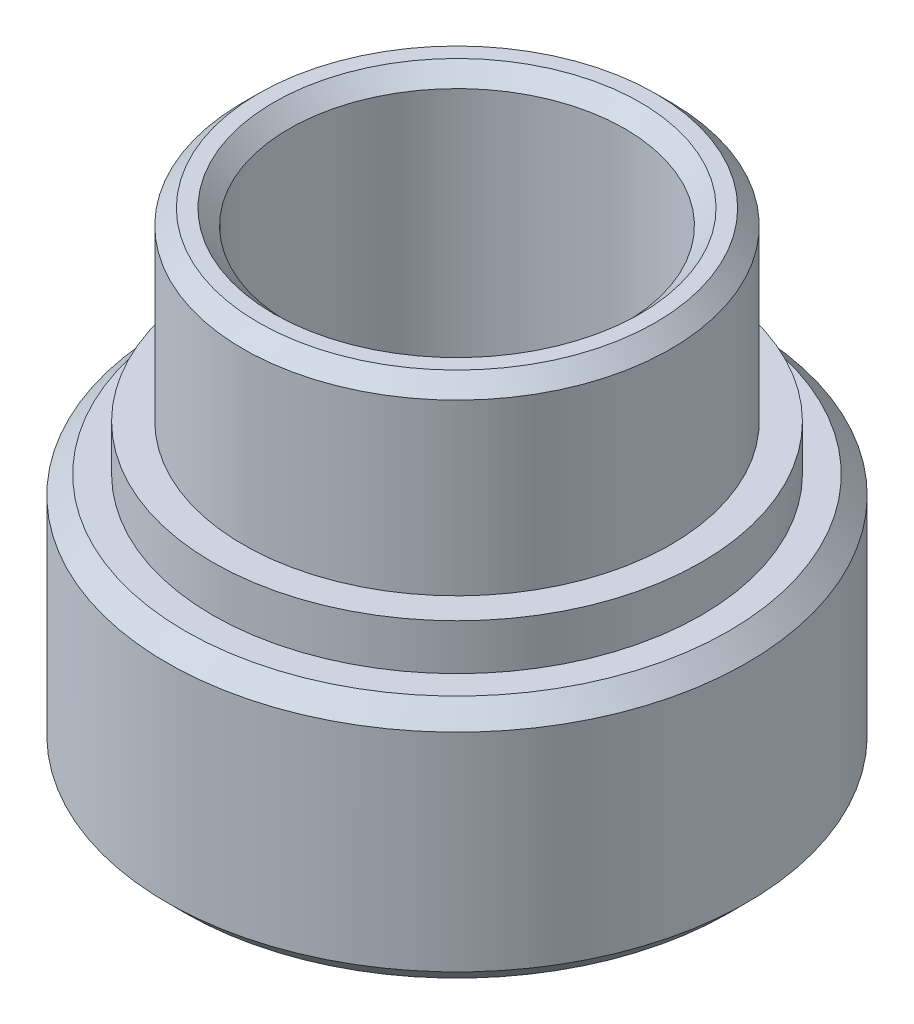
ISO-10303-21;
HEADER;
FILE_DESCRIPTION(('STEP AP214'),'2;1');
FILE_NAME('part.step','',(''),(''),'','','');
FILE_SCHEMA(('AUTOMOTIVE_DESIGN { 1 0 10303 214 1 1 1 1 }'));
ENDSEC;
DATA;
#1=APPLICATION_CONTEXT('core data for automotive mechanical design processes');
#2=APPLICATION_PROTOCOL_DEFINITION('international standard','automotive_design',2000,#1);
#3=PRODUCT_CONTEXT('',#1,'mechanical');
#4=PRODUCT('Part','Part','',(#3));
#5=PRODUCT_RELATED_PRODUCT_CATEGORY('part','',(#4));
#6=PRODUCT_DEFINITION_FORMATION('','',#4);
#7=PRODUCT_DEFINITION_CONTEXT('part definition',#1,'design');
#8=PRODUCT_DEFINITION('design','',#6,#7);
#9=PRODUCT_DEFINITION_SHAPE('','',#8);
#10=(LENGTH_UNIT() NAMED_UNIT(*) SI_UNIT(.MILLI.,.METRE.));
#11=(NAMED_UNIT(*) PLANE_ANGLE_UNIT() SI_UNIT($,.RADIAN.));
#12=(NAMED_UNIT(*) SI_UNIT($,.STERADIAN.) SOLID_ANGLE_UNIT());
#13=UNCERTAINTY_MEASURE_WITH_UNIT(LENGTH_MEASURE(1.E-05),#10,'distance_accuracy_value','');
#14=(GEOMETRIC_REPRESENTATION_CONTEXT(3) GLOBAL_UNCERTAINTY_ASSIGNED_CONTEXT((#13)) GLOBAL_UNIT_ASSIGNED_CONTEXT((#10,
#11,#12)) REPRESENTATION_CONTEXT('',''));
#15=CARTESIAN_POINT('',(0.,0.,0.));
#16=DIRECTION('',(0.,0.,1.));
#17=DIRECTION('',(1.,0.,0.));
#18=AXIS2_PLACEMENT_3D('',#15,#16,#17);
#19=CARTESIAN_POINT('',(0.,1.30917054545158,0.));
#20=DIRECTION('',(0.,-1.,0.));
#21=DIRECTION('',(0.,0.,-1.));
#22=AXIS2_PLACEMENT_3D('',#19,#20,#21);
#23=PLANE('',#22);
#24=CARTESIAN_POINT('',(0.,1.30917054545158,0.));
#25=DIRECTION('',(0.,-1.,0.));
#26=DIRECTION('',(0.,0.,-1.));
#27=AXIS2_PLACEMENT_3D('',#24,#25,#26);
#28=CIRCLE('',#27,2.75);
#29=CARTESIAN_POINT('',(0.,1.30917054545158,-2.75));
#30=VERTEX_POINT('',#29);
#31=EDGE_CURVE('E17',#30,#30,#28,.F.);
#32=ORIENTED_EDGE('',*,*,#31,.T.);
#33=EDGE_LOOP('',(#32));
#34=FACE_BOUND('',#33,.T.);
#35=ADVANCED_FACE('F14',(#34),#23,.F.);
#36=CARTESIAN_POINT('',(0.,1.75,0.));
#37=DIRECTION('',(0.,-1.,0.));
#38=DIRECTION('',(0.,0.,-1.));
#39=AXIS2_PLACEMENT_3D('',#36,#37,#38);
#40=CYLINDRICAL_SURFACE('',#39,2.75);
#41=CARTESIAN_POINT('',(0.,5.52500000009104,0.));
#42=DIRECTION('',(0.,1.,0.));
#43=DIRECTION('',(0.,0.,1.));
#44=AXIS2_PLACEMENT_3D('',#41,#42,#43);
#45=CIRCLE('',#44,2.75000000004866);
#46=CARTESIAN_POINT('',(0.,5.52500000009104,2.75000000004866));
#47=VERTEX_POINT('',#46);
#48=EDGE_CURVE('E50',#47,#47,#45,.T.);
#49=ORIENTED_EDGE('',*,*,#48,.T.);
#50=EDGE_LOOP('',(#49));
#51=FACE_BOUND('',#50,.T.);
#52=ORIENTED_EDGE('',*,*,#31,.F.);
#53=EDGE_LOOP('',(#52));
#54=FACE_BOUND('',#53,.T.);
#55=ADVANCED_FACE('F97',(#51,#54),#40,.F.);
#56=CARTESIAN_POINT('',(0.,5.7749999999146,0.));
#57=DIRECTION('',(0.,1.,0.));
#58=DIRECTION('',(0.,0.,1.));
#59=AXIS2_PLACEMENT_3D('',#56,#57,#58);
#60=CONICAL_SURFACE('',#59,2.99999999992906,0.785398163511135);
#61=ORIENTED_EDGE('',*,*,#48,.F.);
#62=EDGE_LOOP('',(#61));
#63=FACE_BOUND('',#62,.T.);
#64=CARTESIAN_POINT('',(0.,5.7749999999146,0.));
#65=DIRECTION('',(0.,1.,0.));
#66=DIRECTION('',(0.,0.,1.));
#67=AXIS2_PLACEMENT_3D('',#64,#65,#66);
#68=CIRCLE('',#67,2.99999999992906);
#69=CARTESIAN_POINT('',(0.,5.7749999999146,2.99999999992906));
#70=VERTEX_POINT('',#69);
#71=EDGE_CURVE('E54',#70,#70,#68,.F.);
#72=ORIENTED_EDGE('',*,*,#71,.F.);
#73=EDGE_LOOP('',(#72));
#74=FACE_BOUND('',#73,.T.);
#75=ADVANCED_FACE('F94',(#63,#74),#60,.F.);
#76=CARTESIAN_POINT('',(0.,-1.30917054545158,0.));
#77=DIRECTION('',(0.,1.,0.));
#78=DIRECTION('',(0.,0.,1.));
#79=AXIS2_PLACEMENT_3D('',#76,#77,#78);
#80=PLANE('',#79);
#81=CARTESIAN_POINT('',(0.,-1.30917054545158,0.));
#82=DIRECTION('',(0.,-1.,0.));
#83=DIRECTION('',(0.,0.,-1.));
#84=AXIS2_PLACEMENT_3D('',#81,#82,#83);
#85=CIRCLE('',#84,2.75);
#86=CARTESIAN_POINT('',(0.,-1.30917054545158,-2.75));
#87=VERTEX_POINT('',#86);
#88=EDGE_CURVE('E84',#87,#87,#85,.T.);
#89=ORIENTED_EDGE('',*,*,#88,.T.);
#90=EDGE_LOOP('',(#89));
#91=FACE_BOUND('',#90,.T.);
#92=ADVANCED_FACE('F96',(#91),#80,.F.);
#93=CARTESIAN_POINT('',(3.5,5.775,0.));
#94=DIRECTION('',(0.,1.,0.));
#95=DIRECTION('',(0.,0.,1.));
#96=AXIS2_PLACEMENT_3D('',#93,#94,#95);
#97=PLANE('',#96);
#98=ORIENTED_EDGE('',*,*,#71,.T.);
#99=EDGE_LOOP('',(#98));
#100=FACE_BOUND('',#99,.T.);
#101=CARTESIAN_POINT('',(0.,5.77499999997144,0.));
#102=DIRECTION('',(0.,-1.,0.));
#103=DIRECTION('',(0.,0.,-1.));
#104=AXIS2_PLACEMENT_3D('',#101,#102,#103);
#105=CIRCLE('',#104,3.24999999997999);
#106=CARTESIAN_POINT('',(0.,5.77499999997144,-3.24999999997999));
#107=VERTEX_POINT('',#106);
#108=EDGE_CURVE('E49',#107,#107,#105,.T.);
#109=ORIENTED_EDGE('',*,*,#108,.F.);
#110=EDGE_LOOP('',(#109));
#111=FACE_BOUND('',#110,.T.);
#112=ADVANCED_FACE('F91',(#100,#111),#97,.T.);
#113=CARTESIAN_POINT('',(0.,1.75,0.));
#114=DIRECTION('',(0.,-1.,0.));
#115=DIRECTION('',(0.,0.,-1.));
#116=AXIS2_PLACEMENT_3D('',#113,#114,#115);
#117=CYLINDRICAL_SURFACE('',#116,2.75);
#118=ORIENTED_EDGE('',*,*,#88,.F.);
#119=EDGE_LOOP('',(#118));
#120=FACE_BOUND('',#119,.T.);
#121=CARTESIAN_POINT('',(0.,-2.02499999988959,0.));
#122=DIRECTION('',(0.,-1.,0.));
#123=DIRECTION('',(0.,0.,-1.));
#124=AXIS2_PLACEMENT_3D('',#121,#122,#123);
#125=CIRCLE('',#124,2.75000000004866);
#126=CARTESIAN_POINT('',(0.,-2.02499999988959,-2.75000000004866));
#127=VERTEX_POINT('',#126);
#128=EDGE_CURVE('E45',#127,#127,#125,.T.);
#129=ORIENTED_EDGE('',*,*,#128,.T.);
#130=EDGE_LOOP('',(#129));
#131=FACE_BOUND('',#130,.T.);
#132=ADVANCED_FACE('F163',(#120,#131),#117,.F.);
#133=CARTESIAN_POINT('',(0.,5.5250000000342,0.));
#134=DIRECTION('',(0.,-1.,0.));
#135=DIRECTION('',(0.,0.,-1.));
#136=AXIS2_PLACEMENT_3D('',#133,#134,#135);
#137=CONICAL_SURFACE('',#136,3.49999999991724,0.785398163397448);
#138=ORIENTED_EDGE('',*,*,#108,.T.);
#139=EDGE_LOOP('',(#138));
#140=FACE_BOUND('',#139,.T.);
#141=CARTESIAN_POINT('',(0.,5.52499999997735,0.));
#142=DIRECTION('',(0.,-1.,0.));
#143=DIRECTION('',(0.,0.,-1.));
#144=AXIS2_PLACEMENT_3D('',#141,#142,#143);
#145=CIRCLE('',#144,3.5);
#146=CARTESIAN_POINT('',(0.,5.52499999997735,-3.5));
#147=VERTEX_POINT('',#146);
#148=EDGE_CURVE('E40',#147,#147,#145,.T.);
#149=ORIENTED_EDGE('',*,*,#148,.F.);
#150=EDGE_LOOP('',(#149));
#151=FACE_BOUND('',#150,.T.);
#152=ADVANCED_FACE('F159',(#140,#151),#137,.T.);
#153=CARTESIAN_POINT('',(0.,-2.27499999988368,0.));
#154=DIRECTION('',(0.,-1.,0.));
#155=DIRECTION('',(0.,0.,-1.));
#156=AXIS2_PLACEMENT_3D('',#153,#154,#155);
#157=CONICAL_SURFACE('',#156,3.00000000004275,0.785398163397448);
#158=ORIENTED_EDGE('',*,*,#128,.F.);
#159=EDGE_LOOP('',(#158));
#160=FACE_BOUND('',#159,.T.);
#161=CARTESIAN_POINT('',(0.,-2.27499999988368,0.));
#162=DIRECTION('',(0.,-1.,0.));
#163=DIRECTION('',(0.,0.,-1.));
#164=AXIS2_PLACEMENT_3D('',#161,#162,#163);
#165=CIRCLE('',#164,3.00000000004275);
#166=CARTESIAN_POINT('',(0.,-2.27499999988368,-3.00000000004275));
#167=VERTEX_POINT('',#166);
#168=EDGE_CURVE('E44',#167,#167,#165,.F.);
#169=ORIENTED_EDGE('',*,*,#168,.F.);
#170=EDGE_LOOP('',(#169));
#171=FACE_BOUND('',#170,.T.);
#172=ADVANCED_FACE('F155',(#160,#171),#157,.F.);
#173=CARTESIAN_POINT('',(0.,4.2625,0.));
#174=DIRECTION('',(0.,-1.,0.));
#175=DIRECTION('',(0.,0.,-1.));
#176=AXIS2_PLACEMENT_3D('',#173,#174,#175);
#177=CYLINDRICAL_SURFACE('',#176,3.5);
#178=ORIENTED_EDGE('',*,*,#148,.T.);
#179=EDGE_LOOP('',(#178));
#180=FACE_BOUND('',#179,.T.);
#181=CARTESIAN_POINT('',(0.,2.75,0.));
#182=DIRECTION('',(0.,-1.,0.));
#183=DIRECTION('',(0.,0.,-1.));
#184=AXIS2_PLACEMENT_3D('',#181,#182,#183);
#185=CIRCLE('',#184,3.5);
#186=CARTESIAN_POINT('',(0.,2.75,-3.5));
#187=VERTEX_POINT('',#186);
#188=EDGE_CURVE('E74',#187,#187,#185,.T.);
#189=ORIENTED_EDGE('',*,*,#188,.F.);
#190=EDGE_LOOP('',(#189));
#191=FACE_BOUND('',#190,.T.);
#192=ADVANCED_FACE('F151',(#180,#191),#177,.T.);
#193=CARTESIAN_POINT('',(2.75,-2.275,0.));
#194=DIRECTION('',(0.,-1.,0.));
#195=DIRECTION('',(0.,0.,-1.));
#196=AXIS2_PLACEMENT_3D('',#193,#194,#195);
#197=PLANE('',#196);
#198=ORIENTED_EDGE('',*,*,#168,.T.);
#199=EDGE_LOOP('',(#198));
#200=FACE_BOUND('',#199,.T.);
#201=CARTESIAN_POINT('',(0.,-2.27499999994052,0.));
#202=DIRECTION('',(0.,1.,0.));
#203=DIRECTION('',(0.,0.,1.));
#204=AXIS2_PLACEMENT_3D('',#201,#202,#203);
#205=CIRCLE('',#204,3.24999999997999);
#206=CARTESIAN_POINT('',(0.,-2.27499999994052,3.24999999997999));
#207=VERTEX_POINT('',#206);
#208=EDGE_CURVE('E71',#207,#207,#205,.T.);
#209=ORIENTED_EDGE('',*,*,#208,.F.);
#210=EDGE_LOOP('',(#209));
#211=FACE_BOUND('',#210,.T.);
#212=ADVANCED_FACE('F147',(#200,#211),#197,.T.);
#213=CARTESIAN_POINT('',(4.,2.75,0.));
#214=DIRECTION('',(0.,1.,0.));
#215=DIRECTION('',(0.,0.,1.));
#216=AXIS2_PLACEMENT_3D('',#213,#214,#215);
#217=PLANE('',#216);
#218=ORIENTED_EDGE('',*,*,#188,.T.);
#219=EDGE_LOOP('',(#218));
#220=FACE_BOUND('',#219,.T.);
#221=CARTESIAN_POINT('',(0.,2.75,0.));
#222=DIRECTION('',(0.,-1.,0.));
#223=DIRECTION('',(0.,0.,-1.));
#224=AXIS2_PLACEMENT_3D('',#221,#222,#223);
#225=CIRCLE('',#224,4.);
#226=CARTESIAN_POINT('',(0.,2.75,-4.));
#227=VERTEX_POINT('',#226);
#228=EDGE_CURVE('E39',#227,#227,#225,.T.);
#229=ORIENTED_EDGE('',*,*,#228,.F.);
#230=EDGE_LOOP('',(#229));
#231=FACE_BOUND('',#230,.T.);
#232=ADVANCED_FACE('F143',(#220,#231),#217,.T.);
#233=CARTESIAN_POINT('',(0.,-2.02500000000327,0.));
#234=DIRECTION('',(0.,1.,0.));
#235=DIRECTION('',(0.,0.,1.));
#236=AXIS2_PLACEMENT_3D('',#233,#234,#235);
#237=CONICAL_SURFACE('',#236,3.49999999991724,0.785398163397448);
#238=CARTESIAN_POINT('',(0.,-2.02499999994643,0.));
#239=DIRECTION('',(0.,-1.,0.));
#240=DIRECTION('',(0.,0.,-1.));
#241=AXIS2_PLACEMENT_3D('',#238,#239,#240);
#242=CIRCLE('',#241,3.5);
#243=CARTESIAN_POINT('',(0.,-2.02499999994643,-3.5));
#244=VERTEX_POINT('',#243);
#245=EDGE_CURVE('E34',#244,#244,#242,.F.);
#246=ORIENTED_EDGE('',*,*,#245,.F.);
#247=EDGE_LOOP('',(#246));
#248=FACE_BOUND('',#247,.T.);
#249=ORIENTED_EDGE('',*,*,#208,.T.);
#250=EDGE_LOOP('',(#249));
#251=FACE_BOUND('',#250,.T.);
#252=ADVANCED_FACE('F139',(#248,#251),#237,.T.);
#253=CARTESIAN_POINT('',(0.,2.375,0.));
#254=DIRECTION('',(0.,-1.,0.));
#255=DIRECTION('',(0.,0.,-1.));
#256=AXIS2_PLACEMENT_3D('',#253,#254,#255);
#257=CYLINDRICAL_SURFACE('',#256,4.);
#258=ORIENTED_EDGE('',*,*,#228,.T.);
#259=EDGE_LOOP('',(#258));
#260=FACE_BOUND('',#259,.T.);
#261=CARTESIAN_POINT('',(0.,2.,0.));
#262=DIRECTION('',(0.,-1.,0.));
#263=DIRECTION('',(0.,0.,-1.));
#264=AXIS2_PLACEMENT_3D('',#261,#262,#263);
#265=CIRCLE('',#264,4.);
#266=CARTESIAN_POINT('',(0.,2.,-4.));
#267=VERTEX_POINT('',#266);
#268=EDGE_CURVE('E38',#267,#267,#265,.T.);
#269=ORIENTED_EDGE('',*,*,#268,.F.);
#270=EDGE_LOOP('',(#269));
#271=FACE_BOUND('',#270,.T.);
#272=ADVANCED_FACE('F135',(#260,#271),#257,.T.);
#273=CARTESIAN_POINT('',(0.,-2.1375,0.));
#274=DIRECTION('',(0.,-1.,0.));
#275=DIRECTION('',(0.,0.,-1.));
#276=AXIS2_PLACEMENT_3D('',#273,#274,#275);
#277=CYLINDRICAL_SURFACE('',#276,3.5);
#278=ORIENTED_EDGE('',*,*,#245,.T.);
#279=EDGE_LOOP('',(#278));
#280=FACE_BOUND('',#279,.T.);
#281=CARTESIAN_POINT('',(0.,-2.,0.));
#282=DIRECTION('',(0.,-1.,0.));
#283=DIRECTION('',(0.,0.,-1.));
#284=AXIS2_PLACEMENT_3D('',#281,#282,#283);
#285=CIRCLE('',#284,3.5);
#286=CARTESIAN_POINT('',(0.,-2.,-3.5));
#287=VERTEX_POINT('',#286);
#288=EDGE_CURVE('E61',#287,#287,#285,.F.);
#289=ORIENTED_EDGE('',*,*,#288,.F.);
#290=EDGE_LOOP('',(#289));
#291=FACE_BOUND('',#290,.T.);
#292=ADVANCED_FACE('F131',(#280,#291),#277,.T.);
#293=CARTESIAN_POINT('',(4.75,2.,0.));
#294=DIRECTION('',(0.,1.,0.));
#295=DIRECTION('',(0.,0.,1.));
#296=AXIS2_PLACEMENT_3D('',#293,#294,#295);
#297=PLANE('',#296);
#298=ORIENTED_EDGE('',*,*,#268,.T.);
#299=EDGE_LOOP('',(#298));
#300=FACE_BOUND('',#299,.T.);
#301=CARTESIAN_POINT('',(0.,1.99999999995271,0.));
#302=DIRECTION('',(0.,-1.,0.));
#303=DIRECTION('',(0.,0.,-1.));
#304=AXIS2_PLACEMENT_3D('',#301,#302,#303);
#305=CIRCLE('',#304,4.45000000001983);
#306=CARTESIAN_POINT('',(0.,1.99999999995271,-4.45000000001983));
#307=VERTEX_POINT('',#306);
#308=EDGE_CURVE('E57',#307,#307,#305,.T.);
#309=ORIENTED_EDGE('',*,*,#308,.F.);
#310=EDGE_LOOP('',(#309));
#311=FACE_BOUND('',#310,.T.);
#312=ADVANCED_FACE('F127',(#300,#311),#297,.T.);
#313=CARTESIAN_POINT('',(3.5,-2.,0.));
#314=DIRECTION('',(0.,-1.,0.));
#315=DIRECTION('',(0.,0.,-1.));
#316=AXIS2_PLACEMENT_3D('',#313,#314,#315);
#317=PLANE('',#316);
#318=ORIENTED_EDGE('',*,*,#288,.T.);
#319=EDGE_LOOP('',(#318));
#320=FACE_BOUND('',#319,.T.);
#321=CARTESIAN_POINT('',(0.,-1.99999999989586,0.));
#322=DIRECTION('',(0.,1.,0.));
#323=DIRECTION('',(-1.,0.,0.));
#324=AXIS2_PLACEMENT_3D('',#321,#322,#323);
#325=CIRCLE('',#324,4.45000000001983);
#326=CARTESIAN_POINT('',(-4.45000000001983,-1.99999999989586,0.));
#327=VERTEX_POINT('',#326);
#328=EDGE_CURVE('E31',#327,#327,#325,.T.);
#329=ORIENTED_EDGE('',*,*,#328,.F.);
#330=EDGE_LOOP('',(#329));
#331=FACE_BOUND('',#330,.T.);
#332=ADVANCED_FACE('F123',(#320,#331),#317,.T.);
#333=CARTESIAN_POINT('',(0.,1.6999999992322,0.));
#334=DIRECTION('',(0.,-1.,0.));
#335=DIRECTION('',(0.,0.,-1.));
#336=AXIS2_PLACEMENT_3D('',#333,#334,#335);
#337=CONICAL_SURFACE('',#336,4.75000000074033,0.785398163397448);
#338=CARTESIAN_POINT('',(0.,1.69999999917536,0.));
#339=DIRECTION('',(0.,-1.,0.));
#340=DIRECTION('',(0.,0.,-1.));
#341=AXIS2_PLACEMENT_3D('',#338,#339,#340);
#342=CIRCLE('',#341,4.75);
#343=CARTESIAN_POINT('',(0.,1.69999999917536,-4.75));
#344=VERTEX_POINT('',#343);
#345=EDGE_CURVE('E22',#344,#344,#342,.T.);
#346=ORIENTED_EDGE('',*,*,#345,.F.);
#347=EDGE_LOOP('',(#346));
#348=FACE_BOUND('',#347,.T.);
#349=ORIENTED_EDGE('',*,*,#308,.T.);
#350=EDGE_LOOP('',(#349));
#351=FACE_BOUND('',#350,.T.);
#352=ADVANCED_FACE('F116',(#348,#351),#337,.T.);
#353=CARTESIAN_POINT('',(0.,-1.69999999917536,0.));
#354=DIRECTION('',(0.,1.,0.));
#355=DIRECTION('',(-1.,0.,0.));
#356=AXIS2_PLACEMENT_3D('',#353,#354,#355);
#357=CONICAL_SURFACE('',#356,4.75000000074033,0.785398163397448);
#358=CARTESIAN_POINT('',(0.,-1.69999999911852,0.));
#359=DIRECTION('',(0.,-1.,0.));
#360=DIRECTION('',(0.,0.,-1.));
#361=AXIS2_PLACEMENT_3D('',#358,#359,#360);
#362=CIRCLE('',#361,4.75);
#363=CARTESIAN_POINT('',(0.,-1.69999999911852,-4.75));
#364=VERTEX_POINT('',#363);
#365=EDGE_CURVE('E10',#364,#364,#362,.F.);
#366=ORIENTED_EDGE('',*,*,#365,.F.);
#367=EDGE_LOOP('',(#366));
#368=FACE_BOUND('',#367,.T.);
#369=ORIENTED_EDGE('',*,*,#328,.T.);
#370=EDGE_LOOP('',(#369));
#371=FACE_BOUND('',#370,.T.);
#372=ADVANCED_FACE('F111',(#368,#371),#357,.T.);
#373=CARTESIAN_POINT('',(0.,0.,0.));
#374=DIRECTION('',(0.,-1.,0.));
#375=DIRECTION('',(0.,0.,-1.));
#376=AXIS2_PLACEMENT_3D('',#373,#374,#375);
#377=CYLINDRICAL_SURFACE('',#376,4.75);
#378=ORIENTED_EDGE('',*,*,#365,.T.);
#379=EDGE_LOOP('',(#378));
#380=FACE_BOUND('',#379,.T.);
#381=ORIENTED_EDGE('',*,*,#345,.T.);
#382=EDGE_LOOP('',(#381));
#383=FACE_BOUND('',#382,.T.);
#384=ADVANCED_FACE('F109',(#380,#383),#377,.T.);
#385=CLOSED_SHELL('',(#35,#55,#75,#92,#112,#132,#152,#172,#192,#212,#232,#252,#272,#292,#312,
#332,#352,#372,#384));
#386=MANIFOLD_SOLID_BREP('B1',#385);
#387=ADVANCED_BREP_SHAPE_REPRESENTATION('',(#18,#386),#14);
#388=SHAPE_DEFINITION_REPRESENTATION(#9,#387);
ENDSEC;
END-ISO-10303-21;
